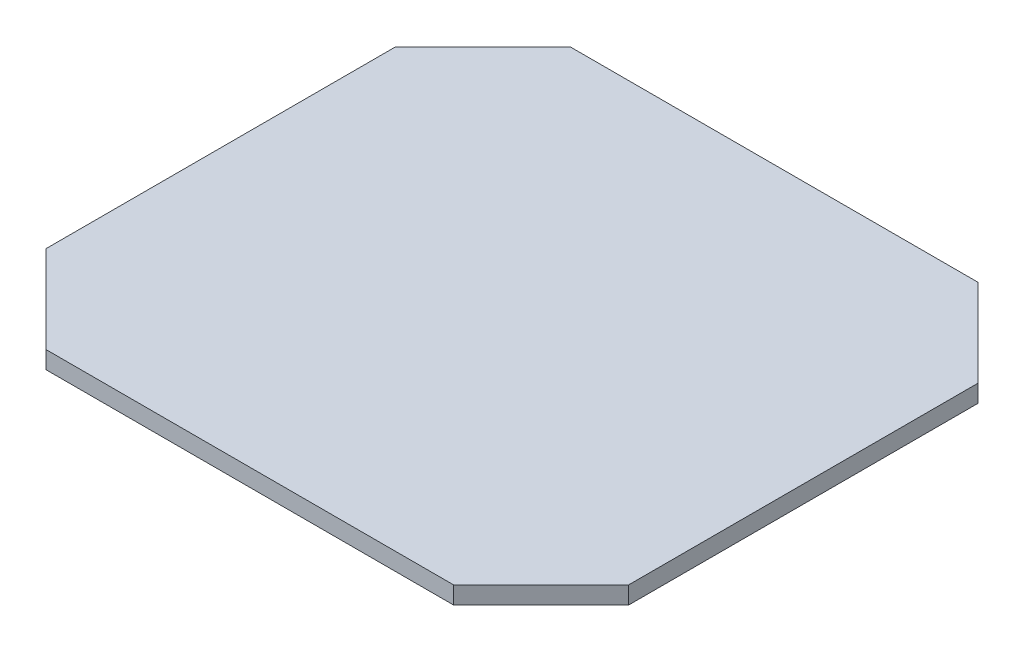
ISO-10303-21;
HEADER;
FILE_DESCRIPTION(('STEP AP214'),'2;1');
FILE_NAME('part.step','',(''),(''),'','','');
FILE_SCHEMA(('AUTOMOTIVE_DESIGN { 1 0 10303 214 1 1 1 1 }'));
ENDSEC;
DATA;
#1=APPLICATION_CONTEXT('core data for automotive mechanical design processes');
#2=APPLICATION_PROTOCOL_DEFINITION('international standard','automotive_design',2000,#1);
#3=PRODUCT_CONTEXT('',#1,'mechanical');
#4=PRODUCT('Part','Part','',(#3));
#5=PRODUCT_RELATED_PRODUCT_CATEGORY('part','',(#4));
#6=PRODUCT_DEFINITION_FORMATION('','',#4);
#7=PRODUCT_DEFINITION_CONTEXT('part definition',#1,'design');
#8=PRODUCT_DEFINITION('design','',#6,#7);
#9=PRODUCT_DEFINITION_SHAPE('','',#8);
#10=(LENGTH_UNIT() NAMED_UNIT(*) SI_UNIT(.MILLI.,.METRE.));
#11=(NAMED_UNIT(*) PLANE_ANGLE_UNIT() SI_UNIT($,.RADIAN.));
#12=(NAMED_UNIT(*) SI_UNIT($,.STERADIAN.) SOLID_ANGLE_UNIT());
#13=UNCERTAINTY_MEASURE_WITH_UNIT(LENGTH_MEASURE(1.E-05),#10,'distance_accuracy_value','');
#14=(GEOMETRIC_REPRESENTATION_CONTEXT(3) GLOBAL_UNCERTAINTY_ASSIGNED_CONTEXT((#13)) GLOBAL_UNIT_ASSIGNED_CONTEXT((#10,
#11,#12)) REPRESENTATION_CONTEXT('',''));
#15=CARTESIAN_POINT('',(0.,0.,0.));
#16=DIRECTION('',(0.,0.,1.));
#17=DIRECTION('',(1.,0.,0.));
#18=AXIS2_PLACEMENT_3D('',#15,#16,#17);
#19=CARTESIAN_POINT('',(100.,3.,90.));
#20=DIRECTION('',(-1.,0.,0.));
#21=DIRECTION('',(0.,0.,1.));
#22=AXIS2_PLACEMENT_3D('',#19,#20,#21);
#23=PLANE('',#22);
#24=DIRECTION('',(0.,0.,-1.));
#25=VECTOR('',#24,1.);
#26=CARTESIAN_POINT('',(100.,3.,90.));
#27=LINE('',#26,#25);
#28=CARTESIAN_POINT('',(100.,3.,60.));
#29=VERTEX_POINT('',#28);
#30=CARTESIAN_POINT('',(100.,3.,-59.9999999999998));
#31=VERTEX_POINT('',#30);
#32=EDGE_CURVE('E129',#29,#31,#27,.T.);
#33=ORIENTED_EDGE('',*,*,#32,.F.);
#34=DIRECTION('',(0.,-1.,0.));
#35=VECTOR('',#34,1.);
#36=CARTESIAN_POINT('',(100.,3.,60.));
#37=LINE('',#36,#35);
#38=CARTESIAN_POINT('',(100.,-3.,60.));
#39=VERTEX_POINT('',#38);
#40=EDGE_CURVE('E114',#29,#39,#37,.T.);
#41=ORIENTED_EDGE('',*,*,#40,.T.);
#42=DIRECTION('',(0.,0.,-1.));
#43=VECTOR('',#42,1.);
#44=CARTESIAN_POINT('',(100.,-3.,90.));
#45=LINE('',#44,#43);
#46=CARTESIAN_POINT('',(100.,-3.,-59.9999999999998));
#47=VERTEX_POINT('',#46);
#48=EDGE_CURVE('E126',#39,#47,#45,.T.);
#49=ORIENTED_EDGE('',*,*,#48,.T.);
#50=DIRECTION('',(0.,1.,0.));
#51=VECTOR('',#50,1.);
#52=CARTESIAN_POINT('',(100.,3.,-59.9999999999999));
#53=LINE('',#52,#51);
#54=EDGE_CURVE('E131',#47,#31,#53,.T.);
#55=ORIENTED_EDGE('',*,*,#54,.T.);
#56=EDGE_LOOP('',(#33,#41,#49,#55));
#57=FACE_BOUND('',#56,.T.);
#58=ADVANCED_FACE('F43',(#57),#23,.F.);
#59=CARTESIAN_POINT('',(-100.,3.,-90.));
#60=DIRECTION('',(0.,0.,1.));
#61=DIRECTION('',(1.,0.,0.));
#62=AXIS2_PLACEMENT_3D('',#59,#60,#61);
#63=PLANE('',#62);
#64=DIRECTION('',(-1.,0.,0.));
#65=VECTOR('',#64,1.);
#66=CARTESIAN_POINT('',(-100.,3.,-90.));
#67=LINE('',#66,#65);
#68=CARTESIAN_POINT('',(70.,3.,-90.));
#69=VERTEX_POINT('',#68);
#70=CARTESIAN_POINT('',(-70.,3.,-90.));
#71=VERTEX_POINT('',#70);
#72=EDGE_CURVE('E171',#69,#71,#67,.T.);
#73=ORIENTED_EDGE('',*,*,#72,.F.);
#74=DIRECTION('',(0.,-1.,0.));
#75=VECTOR('',#74,1.);
#76=CARTESIAN_POINT('',(70.,3.,-90.));
#77=LINE('',#76,#75);
#78=CARTESIAN_POINT('',(70.,-3.,-90.));
#79=VERTEX_POINT('',#78);
#80=EDGE_CURVE('E164',#69,#79,#77,.T.);
#81=ORIENTED_EDGE('',*,*,#80,.T.);
#82=DIRECTION('',(-1.,0.,0.));
#83=VECTOR('',#82,1.);
#84=CARTESIAN_POINT('',(-100.,-3.,-90.));
#85=LINE('',#84,#83);
#86=CARTESIAN_POINT('',(-70.,-3.,-90.));
#87=VERTEX_POINT('',#86);
#88=EDGE_CURVE('E135',#79,#87,#85,.T.);
#89=ORIENTED_EDGE('',*,*,#88,.T.);
#90=DIRECTION('',(0.,1.,0.));
#91=VECTOR('',#90,1.);
#92=CARTESIAN_POINT('',(-70.,3.,-90.));
#93=LINE('',#92,#91);
#94=EDGE_CURVE('E162',#87,#71,#93,.T.);
#95=ORIENTED_EDGE('',*,*,#94,.T.);
#96=EDGE_LOOP('',(#73,#81,#89,#95));
#97=FACE_BOUND('',#96,.T.);
#98=ADVANCED_FACE('F169',(#97),#63,.F.);
#99=CARTESIAN_POINT('',(-100.,3.,90.));
#100=DIRECTION('',(1.,0.,0.));
#101=DIRECTION('',(0.,0.,-1.));
#102=AXIS2_PLACEMENT_3D('',#99,#100,#101);
#103=PLANE('',#102);
#104=DIRECTION('',(0.,0.,1.));
#105=VECTOR('',#104,1.);
#106=CARTESIAN_POINT('',(-100.,3.,90.));
#107=LINE('',#106,#105);
#108=CARTESIAN_POINT('',(-100.,3.,-60.));
#109=VERTEX_POINT('',#108);
#110=CARTESIAN_POINT('',(-100.,3.,59.9999999999999));
#111=VERTEX_POINT('',#110);
#112=EDGE_CURVE('E179',#109,#111,#107,.T.);
#113=ORIENTED_EDGE('',*,*,#112,.F.);
#114=DIRECTION('',(0.,-1.,0.));
#115=VECTOR('',#114,1.);
#116=CARTESIAN_POINT('',(-100.,3.,-60.));
#117=LINE('',#116,#115);
#118=CARTESIAN_POINT('',(-100.,-3.,-60.));
#119=VERTEX_POINT('',#118);
#120=EDGE_CURVE('E11',#109,#119,#117,.T.);
#121=ORIENTED_EDGE('',*,*,#120,.T.);
#122=DIRECTION('',(0.,0.,1.));
#123=VECTOR('',#122,1.);
#124=CARTESIAN_POINT('',(-100.,-3.,90.));
#125=LINE('',#124,#123);
#126=CARTESIAN_POINT('',(-100.,-3.,59.9999999999999));
#127=VERTEX_POINT('',#126);
#128=EDGE_CURVE('E138',#119,#127,#125,.T.);
#129=ORIENTED_EDGE('',*,*,#128,.T.);
#130=DIRECTION('',(0.,1.,0.));
#131=VECTOR('',#130,1.);
#132=CARTESIAN_POINT('',(-100.,3.,59.9999999999999));
#133=LINE('',#132,#131);
#134=EDGE_CURVE('E52',#127,#111,#133,.T.);
#135=ORIENTED_EDGE('',*,*,#134,.T.);
#136=EDGE_LOOP('',(#113,#121,#129,#135));
#137=FACE_BOUND('',#136,.T.);
#138=ADVANCED_FACE('F178',(#137),#103,.F.);
#139=CARTESIAN_POINT('',(-100.,3.,90.));
#140=DIRECTION('',(0.,0.,-1.));
#141=DIRECTION('',(-1.,0.,0.));
#142=AXIS2_PLACEMENT_3D('',#139,#140,#141);
#143=PLANE('',#142);
#144=DIRECTION('',(1.,0.,0.));
#145=VECTOR('',#144,1.);
#146=CARTESIAN_POINT('',(-100.,-3.,90.));
#147=LINE('',#146,#145);
#148=CARTESIAN_POINT('',(-70.0000000000001,-3.,90.));
#149=VERTEX_POINT('',#148);
#150=CARTESIAN_POINT('',(69.9999999999999,-3.,90.));
#151=VERTEX_POINT('',#150);
#152=EDGE_CURVE('E145',#149,#151,#147,.T.);
#153=ORIENTED_EDGE('',*,*,#152,.T.);
#154=DIRECTION('',(0.,1.,0.));
#155=VECTOR('',#154,1.);
#156=CARTESIAN_POINT('',(69.9999999999999,3.,90.));
#157=LINE('',#156,#155);
#158=CARTESIAN_POINT('',(69.9999999999999,3.,90.));
#159=VERTEX_POINT('',#158);
#160=EDGE_CURVE('E115',#151,#159,#157,.T.);
#161=ORIENTED_EDGE('',*,*,#160,.T.);
#162=DIRECTION('',(1.,0.,0.));
#163=VECTOR('',#162,1.);
#164=CARTESIAN_POINT('',(-100.,3.,90.));
#165=LINE('',#164,#163);
#166=CARTESIAN_POINT('',(-70.0000000000001,3.,90.));
#167=VERTEX_POINT('',#166);
#168=EDGE_CURVE('E141',#167,#159,#165,.T.);
#169=ORIENTED_EDGE('',*,*,#168,.F.);
#170=DIRECTION('',(0.,-1.,0.));
#171=VECTOR('',#170,1.);
#172=CARTESIAN_POINT('',(-70.0000000000001,3.,90.));
#173=LINE('',#172,#171);
#174=EDGE_CURVE('E120',#167,#149,#173,.T.);
#175=ORIENTED_EDGE('',*,*,#174,.T.);
#176=EDGE_LOOP('',(#153,#161,#169,#175));
#177=FACE_BOUND('',#176,.T.);
#178=ADVANCED_FACE('F213',(#177),#143,.F.);
#179=CARTESIAN_POINT('',(0.,3.,0.));
#180=DIRECTION('',(0.,-1.,0.));
#181=DIRECTION('',(0.,0.,-1.));
#182=AXIS2_PLACEMENT_3D('',#179,#180,#181);
#183=PLANE('',#182);
#184=ORIENTED_EDGE('',*,*,#168,.T.);
#185=DIRECTION('',(-0.707106781186549,0.,0.707106781186546));
#186=VECTOR('',#185,1.);
#187=CARTESIAN_POINT('',(100.,3.,60.));
#188=LINE('',#187,#186);
#189=EDGE_CURVE('E160',#159,#29,#188,.F.);
#190=ORIENTED_EDGE('',*,*,#189,.T.);
#191=ORIENTED_EDGE('',*,*,#32,.T.);
#192=DIRECTION('',(0.707106781186546,0.,0.707106781186549));
#193=VECTOR('',#192,1.);
#194=CARTESIAN_POINT('',(70.,3.,-90.));
#195=LINE('',#194,#193);
#196=EDGE_CURVE('E158',#31,#69,#195,.F.);
#197=ORIENTED_EDGE('',*,*,#196,.T.);
#198=ORIENTED_EDGE('',*,*,#72,.T.);
#199=DIRECTION('',(0.707106781186549,0.,-0.707106781186546));
#200=VECTOR('',#199,1.);
#201=CARTESIAN_POINT('',(-100.,3.,-60.));
#202=LINE('',#201,#200);
#203=EDGE_CURVE('E65',#71,#109,#202,.F.);
#204=ORIENTED_EDGE('',*,*,#203,.T.);
#205=ORIENTED_EDGE('',*,*,#112,.T.);
#206=DIRECTION('',(-0.707106781186546,0.,-0.707106781186549));
#207=VECTOR('',#206,1.);
#208=CARTESIAN_POINT('',(-70.0000000000001,3.,90.));
#209=LINE('',#208,#207);
#210=EDGE_CURVE('E155',#111,#167,#209,.F.);
#211=ORIENTED_EDGE('',*,*,#210,.T.);
#212=EDGE_LOOP('',(#184,#190,#191,#197,#198,#204,#205,#211));
#213=FACE_BOUND('',#212,.T.);
#214=ADVANCED_FACE('F184',(#213),#183,.F.);
#215=CARTESIAN_POINT('',(0.,-3.,0.));
#216=DIRECTION('',(0.,-1.,0.));
#217=DIRECTION('',(0.,0.,-1.));
#218=AXIS2_PLACEMENT_3D('',#215,#216,#217);
#219=PLANE('',#218);
#220=ORIENTED_EDGE('',*,*,#48,.F.);
#221=DIRECTION('',(0.707106781186549,0.,-0.707106781186546));
#222=VECTOR('',#221,1.);
#223=CARTESIAN_POINT('',(79.9999999999998,-3.,80.0000000000001));
#224=LINE('',#223,#222);
#225=EDGE_CURVE('E110',#39,#151,#224,.F.);
#226=ORIENTED_EDGE('',*,*,#225,.T.);
#227=ORIENTED_EDGE('',*,*,#152,.F.);
#228=DIRECTION('',(0.707106781186546,0.,0.707106781186549));
#229=VECTOR('',#228,1.);
#230=CARTESIAN_POINT('',(-80.0000000000002,-3.,79.9999999999998));
#231=LINE('',#230,#229);
#232=EDGE_CURVE('E130',#149,#127,#231,.F.);
#233=ORIENTED_EDGE('',*,*,#232,.T.);
#234=ORIENTED_EDGE('',*,*,#128,.F.);
#235=DIRECTION('',(-0.707106781186549,0.,0.707106781186546));
#236=VECTOR('',#235,1.);
#237=CARTESIAN_POINT('',(-79.9999999999998,-3.,-80.0000000000002));
#238=LINE('',#237,#236);
#239=EDGE_CURVE('E149',#119,#87,#238,.F.);
#240=ORIENTED_EDGE('',*,*,#239,.T.);
#241=ORIENTED_EDGE('',*,*,#88,.F.);
#242=DIRECTION('',(-0.707106781186546,0.,-0.707106781186549));
#243=VECTOR('',#242,1.);
#244=CARTESIAN_POINT('',(80.0000000000002,-3.,-79.9999999999998));
#245=LINE('',#244,#243);
#246=EDGE_CURVE('E121',#79,#47,#245,.F.);
#247=ORIENTED_EDGE('',*,*,#246,.T.);
#248=EDGE_LOOP('',(#220,#226,#227,#233,#234,#240,#241,#247));
#249=FACE_BOUND('',#248,.T.);
#250=ADVANCED_FACE('F133',(#249),#219,.T.);
#251=CARTESIAN_POINT('',(100.,3.,60.));
#252=DIRECTION('',(-0.707106781186546,0.,-0.707106781186549));
#253=DIRECTION('',(0.,-1.,0.));
#254=AXIS2_PLACEMENT_3D('',#251,#252,#253);
#255=PLANE('',#254);
#256=ORIENTED_EDGE('',*,*,#189,.F.);
#257=ORIENTED_EDGE('',*,*,#160,.F.);
#258=ORIENTED_EDGE('',*,*,#225,.F.);
#259=ORIENTED_EDGE('',*,*,#40,.F.);
#260=EDGE_LOOP('',(#256,#257,#258,#259));
#261=FACE_BOUND('',#260,.T.);
#262=ADVANCED_FACE('F113',(#261),#255,.F.);
#263=CARTESIAN_POINT('',(70.,3.,-90.));
#264=DIRECTION('',(-0.707106781186549,0.,0.707106781186546));
#265=DIRECTION('',(0.,-1.,0.));
#266=AXIS2_PLACEMENT_3D('',#263,#264,#265);
#267=PLANE('',#266);
#268=ORIENTED_EDGE('',*,*,#196,.F.);
#269=ORIENTED_EDGE('',*,*,#54,.F.);
#270=ORIENTED_EDGE('',*,*,#246,.F.);
#271=ORIENTED_EDGE('',*,*,#80,.F.);
#272=EDGE_LOOP('',(#268,#269,#270,#271));
#273=FACE_BOUND('',#272,.T.);
#274=ADVANCED_FACE('F185',(#273),#267,.F.);
#275=CARTESIAN_POINT('',(-100.,3.,-60.));
#276=DIRECTION('',(0.707106781186546,0.,0.707106781186549));
#277=DIRECTION('',(0.,-1.,0.));
#278=AXIS2_PLACEMENT_3D('',#275,#276,#277);
#279=PLANE('',#278);
#280=ORIENTED_EDGE('',*,*,#203,.F.);
#281=ORIENTED_EDGE('',*,*,#94,.F.);
#282=ORIENTED_EDGE('',*,*,#239,.F.);
#283=ORIENTED_EDGE('',*,*,#120,.F.);
#284=EDGE_LOOP('',(#280,#281,#282,#283));
#285=FACE_BOUND('',#284,.T.);
#286=ADVANCED_FACE('F177',(#285),#279,.F.);
#287=CARTESIAN_POINT('',(-70.0000000000001,3.,90.));
#288=DIRECTION('',(0.707106781186549,0.,-0.707106781186546));
#289=DIRECTION('',(0.,-1.,0.));
#290=AXIS2_PLACEMENT_3D('',#287,#288,#289);
#291=PLANE('',#290);
#292=ORIENTED_EDGE('',*,*,#210,.F.);
#293=ORIENTED_EDGE('',*,*,#134,.F.);
#294=ORIENTED_EDGE('',*,*,#232,.F.);
#295=ORIENTED_EDGE('',*,*,#174,.F.);
#296=EDGE_LOOP('',(#292,#293,#294,#295));
#297=FACE_BOUND('',#296,.T.);
#298=ADVANCED_FACE('F46',(#297),#291,.F.);
#299=CLOSED_SHELL('',(#58,#98,#138,#178,#214,#250,#262,#274,#286,#298));
#300=MANIFOLD_SOLID_BREP('B2',#299);
#301=ADVANCED_BREP_SHAPE_REPRESENTATION('',(#18,#300),#14);
#302=SHAPE_DEFINITION_REPRESENTATION(#9,#301);
ENDSEC;
END-ISO-10303-21;
